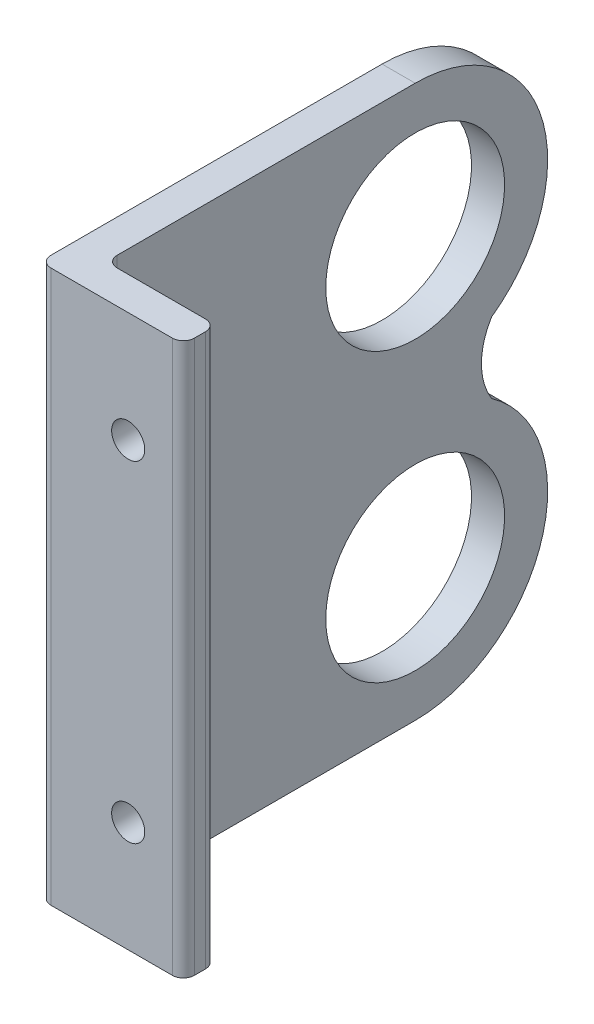
ISO-10303-21;
HEADER;
FILE_DESCRIPTION(('STEP AP214'),'2;1');
FILE_NAME('part.step','',(''),(''),'','','');
FILE_SCHEMA(('AUTOMOTIVE_DESIGN { 1 0 10303 214 1 1 1 1 }'));
ENDSEC;
DATA;
#1=APPLICATION_CONTEXT('core data for automotive mechanical design processes');
#2=APPLICATION_PROTOCOL_DEFINITION('international standard','automotive_design',2000,#1);
#3=PRODUCT_CONTEXT('',#1,'mechanical');
#4=PRODUCT('Part','Part','',(#3));
#5=PRODUCT_RELATED_PRODUCT_CATEGORY('part','',(#4));
#6=PRODUCT_DEFINITION_FORMATION('','',#4);
#7=PRODUCT_DEFINITION_CONTEXT('part definition',#1,'design');
#8=PRODUCT_DEFINITION('design','',#6,#7);
#9=PRODUCT_DEFINITION_SHAPE('','',#8);
#10=(LENGTH_UNIT() NAMED_UNIT(*) SI_UNIT(.MILLI.,.METRE.));
#11=(NAMED_UNIT(*) PLANE_ANGLE_UNIT() SI_UNIT($,.RADIAN.));
#12=(NAMED_UNIT(*) SI_UNIT($,.STERADIAN.) SOLID_ANGLE_UNIT());
#13=UNCERTAINTY_MEASURE_WITH_UNIT(LENGTH_MEASURE(1.E-05),#10,'distance_accuracy_value','');
#14=(GEOMETRIC_REPRESENTATION_CONTEXT(3) GLOBAL_UNCERTAINTY_ASSIGNED_CONTEXT((#13)) GLOBAL_UNIT_ASSIGNED_CONTEXT((#10,
#11,#12)) REPRESENTATION_CONTEXT('',''));
#15=CARTESIAN_POINT('',(0.,0.,0.));
#16=DIRECTION('',(0.,0.,1.));
#17=DIRECTION('',(1.,0.,0.));
#18=AXIS2_PLACEMENT_3D('',#15,#16,#17);
#19=CARTESIAN_POINT('',(3.75000000000001,50.,0.));
#20=DIRECTION('',(1.,0.,0.));
#21=DIRECTION('',(0.,0.,-1.));
#22=AXIS2_PLACEMENT_3D('',#19,#20,#21);
#23=PLANE('',#22);
#24=CARTESIAN_POINT('',(3.75,38.,-19.3125));
#25=DIRECTION('',(-1.,0.,0.));
#26=DIRECTION('',(0.,0.,1.));
#27=AXIS2_PLACEMENT_3D('',#24,#25,#26);
#28=CIRCLE('',#27,8.09999999999999);
#29=CARTESIAN_POINT('',(3.75000000000001,38.,-11.2125));
#30=VERTEX_POINT('',#29);
#31=EDGE_CURVE('E266',#30,#30,#28,.T.);
#32=ORIENTED_EDGE('',*,*,#31,.F.);
#33=EDGE_LOOP('',(#32));
#34=FACE_BOUND('',#33,.T.);
#35=CARTESIAN_POINT('',(3.75,12.,-19.3125));
#36=DIRECTION('',(-1.,0.,0.));
#37=DIRECTION('',(0.,0.,1.));
#38=AXIS2_PLACEMENT_3D('',#35,#36,#37);
#39=CIRCLE('',#38,8.1);
#40=CARTESIAN_POINT('',(3.75000000000001,12.,-11.2125));
#41=VERTEX_POINT('',#40);
#42=EDGE_CURVE('E253',#41,#41,#39,.T.);
#43=ORIENTED_EDGE('',*,*,#42,.F.);
#44=EDGE_LOOP('',(#43));
#45=FACE_BOUND('',#44,.T.);
#46=CARTESIAN_POINT('',(3.75,25.,-31.3125));
#47=DIRECTION('',(-1.,0.,0.));
#48=DIRECTION('',(0.,0.,1.));
#49=AXIS2_PLACEMENT_3D('',#46,#47,#48);
#50=CIRCLE('',#49,6.);
#51=CARTESIAN_POINT('',(3.75,21.8009515210218,-26.2364691855597));
#52=VERTEX_POINT('',#51);
#53=CARTESIAN_POINT('',(3.75,28.1990484789782,-26.2364691855597));
#54=VERTEX_POINT('',#53);
#55=EDGE_CURVE('E237',#52,#54,#50,.T.);
#56=ORIENTED_EDGE('',*,*,#55,.F.);
#57=CARTESIAN_POINT('',(3.75,12.,-19.3125));
#58=DIRECTION('',(-1.,0.,0.));
#59=DIRECTION('',(0.,0.,1.));
#60=AXIS2_PLACEMENT_3D('',#57,#58,#59);
#61=CIRCLE('',#60,12.);
#62=CARTESIAN_POINT('',(3.75,0.,-19.3125));
#63=VERTEX_POINT('',#62);
#64=EDGE_CURVE('E222',#52,#63,#61,.T.);
#65=ORIENTED_EDGE('',*,*,#64,.T.);
#66=DIRECTION('',(0.,0.,1.));
#67=VECTOR('',#66,1.);
#68=CARTESIAN_POINT('',(3.75000000000001,0.,0.));
#69=LINE('',#68,#67);
#70=CARTESIAN_POINT('',(3.75000000000001,0.,10.6875));
#71=VERTEX_POINT('',#70);
#72=EDGE_CURVE('E277',#63,#71,#69,.T.);
#73=ORIENTED_EDGE('',*,*,#72,.T.);
#74=DIRECTION('',(0.,-1.,0.));
#75=VECTOR('',#74,1.);
#76=CARTESIAN_POINT('',(3.75000000000001,50.,10.6875));
#77=LINE('',#76,#75);
#78=CARTESIAN_POINT('',(3.75000000000001,50.,10.6875));
#79=VERTEX_POINT('',#78);
#80=EDGE_CURVE('E12',#79,#71,#77,.T.);
#81=ORIENTED_EDGE('',*,*,#80,.F.);
#82=DIRECTION('',(0.,0.,1.));
#83=VECTOR('',#82,1.);
#84=CARTESIAN_POINT('',(3.75000000000001,50.,0.));
#85=LINE('',#84,#83);
#86=CARTESIAN_POINT('',(3.75,50.,-19.3125));
#87=VERTEX_POINT('',#86);
#88=EDGE_CURVE('E289',#87,#79,#85,.T.);
#89=ORIENTED_EDGE('',*,*,#88,.F.);
#90=CARTESIAN_POINT('',(3.75,38.,-19.3125));
#91=DIRECTION('',(-1.,0.,0.));
#92=DIRECTION('',(0.,0.,1.));
#93=AXIS2_PLACEMENT_3D('',#90,#91,#92);
#94=CIRCLE('',#93,12.);
#95=EDGE_CURVE('E140',#87,#54,#94,.T.);
#96=ORIENTED_EDGE('',*,*,#95,.T.);
#97=EDGE_LOOP('',(#56,#65,#73,#81,#89,#96));
#98=FACE_BOUND('',#97,.T.);
#99=ADVANCED_FACE('F125',(#34,#45,#98),#23,.F.);
#100=CARTESIAN_POINT('',(6.75000000000001,50.,0.));
#101=DIRECTION('',(1.,0.,0.));
#102=DIRECTION('',(0.,0.,-1.));
#103=AXIS2_PLACEMENT_3D('',#100,#101,#102);
#104=PLANE('',#103);
#105=CARTESIAN_POINT('',(6.75,38.,-19.3125));
#106=DIRECTION('',(-1.,0.,0.));
#107=DIRECTION('',(0.,0.,1.));
#108=AXIS2_PLACEMENT_3D('',#105,#106,#107);
#109=CIRCLE('',#108,8.09999999999999);
#110=CARTESIAN_POINT('',(6.75000000000001,38.,-11.2125));
#111=VERTEX_POINT('',#110);
#112=EDGE_CURVE('E257',#111,#111,#109,.T.);
#113=ORIENTED_EDGE('',*,*,#112,.T.);
#114=EDGE_LOOP('',(#113));
#115=FACE_BOUND('',#114,.T.);
#116=CARTESIAN_POINT('',(6.75,12.,-19.3125));
#117=DIRECTION('',(-1.,0.,0.));
#118=DIRECTION('',(0.,0.,1.));
#119=AXIS2_PLACEMENT_3D('',#116,#117,#118);
#120=CIRCLE('',#119,8.1);
#121=CARTESIAN_POINT('',(6.75000000000001,12.,-11.2125));
#122=VERTEX_POINT('',#121);
#123=EDGE_CURVE('E248',#122,#122,#120,.T.);
#124=ORIENTED_EDGE('',*,*,#123,.T.);
#125=EDGE_LOOP('',(#124));
#126=FACE_BOUND('',#125,.T.);
#127=CARTESIAN_POINT('',(6.75,12.,-19.3125));
#128=DIRECTION('',(-1.,0.,0.));
#129=DIRECTION('',(0.,0.,1.));
#130=AXIS2_PLACEMENT_3D('',#127,#128,#129);
#131=CIRCLE('',#130,12.);
#132=CARTESIAN_POINT('',(6.75,21.8009515210218,-26.2364691855597));
#133=VERTEX_POINT('',#132);
#134=CARTESIAN_POINT('',(6.75,0.,-19.3125));
#135=VERTEX_POINT('',#134);
#136=EDGE_CURVE('E148',#133,#135,#131,.T.);
#137=ORIENTED_EDGE('',*,*,#136,.F.);
#138=CARTESIAN_POINT('',(6.75,25.,-31.3125));
#139=DIRECTION('',(-1.,0.,0.));
#140=DIRECTION('',(0.,0.,1.));
#141=AXIS2_PLACEMENT_3D('',#138,#139,#140);
#142=CIRCLE('',#141,6.);
#143=CARTESIAN_POINT('',(6.75,28.1990484789782,-26.2364691855597));
#144=VERTEX_POINT('',#143);
#145=EDGE_CURVE('E217',#133,#144,#142,.T.);
#146=ORIENTED_EDGE('',*,*,#145,.T.);
#147=CARTESIAN_POINT('',(6.75,38.,-19.3125));
#148=DIRECTION('',(-1.,0.,0.));
#149=DIRECTION('',(0.,0.,1.));
#150=AXIS2_PLACEMENT_3D('',#147,#148,#149);
#151=CIRCLE('',#150,12.);
#152=CARTESIAN_POINT('',(6.75,50.,-19.3125));
#153=VERTEX_POINT('',#152);
#154=EDGE_CURVE('E258',#153,#144,#151,.T.);
#155=ORIENTED_EDGE('',*,*,#154,.F.);
#156=DIRECTION('',(0.,0.,1.));
#157=VECTOR('',#156,1.);
#158=CARTESIAN_POINT('',(6.75000000000001,50.,0.));
#159=LINE('',#158,#157);
#160=CARTESIAN_POINT('',(6.75000000000001,50.,7.6875));
#161=VERTEX_POINT('',#160);
#162=EDGE_CURVE('E318',#153,#161,#159,.T.);
#163=ORIENTED_EDGE('',*,*,#162,.T.);
#164=DIRECTION('',(0.,-1.,0.));
#165=VECTOR('',#164,1.);
#166=CARTESIAN_POINT('',(6.75000000000001,50.,7.6875));
#167=LINE('',#166,#165);
#168=CARTESIAN_POINT('',(6.75000000000001,0.,7.6875));
#169=VERTEX_POINT('',#168);
#170=EDGE_CURVE('E321',#161,#169,#167,.T.);
#171=ORIENTED_EDGE('',*,*,#170,.T.);
#172=DIRECTION('',(0.,0.,1.));
#173=VECTOR('',#172,1.);
#174=CARTESIAN_POINT('',(6.75000000000001,0.,0.));
#175=LINE('',#174,#173);
#176=EDGE_CURVE('E219',#135,#169,#175,.T.);
#177=ORIENTED_EDGE('',*,*,#176,.F.);
#178=EDGE_LOOP('',(#137,#146,#155,#163,#171,#177));
#179=FACE_BOUND('',#178,.T.);
#180=ADVANCED_FACE('F214',(#115,#126,#179),#104,.T.);
#181=CARTESIAN_POINT('',(0.,50.,0.));
#182=DIRECTION('',(0.,1.,0.));
#183=DIRECTION('',(0.,0.,1.));
#184=AXIS2_PLACEMENT_3D('',#181,#182,#183);
#185=PLANE('',#184);
#186=ORIENTED_EDGE('',*,*,#162,.F.);
#187=DIRECTION('',(-1.,0.,0.));
#188=VECTOR('',#187,1.);
#189=CARTESIAN_POINT('',(6.75,50.,-19.3125));
#190=LINE('',#189,#188);
#191=EDGE_CURVE('E261',#153,#87,#190,.T.);
#192=ORIENTED_EDGE('',*,*,#191,.T.);
#193=ORIENTED_EDGE('',*,*,#88,.T.);
#194=CARTESIAN_POINT('',(4.75000000000001,50.,10.6875));
#195=DIRECTION('',(0.,1.,0.));
#196=DIRECTION('',(0.,0.,1.));
#197=AXIS2_PLACEMENT_3D('',#194,#195,#196);
#198=CIRCLE('',#197,1.);
#199=CARTESIAN_POINT('',(4.75000000000002,50.,11.6875));
#200=VERTEX_POINT('',#199);
#201=EDGE_CURVE('E292',#79,#200,#198,.T.);
#202=ORIENTED_EDGE('',*,*,#201,.T.);
#203=DIRECTION('',(1.,0.,0.));
#204=VECTOR('',#203,1.);
#205=CARTESIAN_POINT('',(0.,50.,11.6875));
#206=LINE('',#205,#204);
#207=CARTESIAN_POINT('',(15.75,50.,11.6875));
#208=VERTEX_POINT('',#207);
#209=EDGE_CURVE('E295',#200,#208,#206,.T.);
#210=ORIENTED_EDGE('',*,*,#209,.T.);
#211=CARTESIAN_POINT('',(15.75,50.,10.6875));
#212=DIRECTION('',(0.,1.,0.));
#213=DIRECTION('',(0.,0.,1.));
#214=AXIS2_PLACEMENT_3D('',#211,#212,#213);
#215=CIRCLE('',#214,1.);
#216=CARTESIAN_POINT('',(16.75,50.,10.6875));
#217=VERTEX_POINT('',#216);
#218=EDGE_CURVE('E298',#217,#208,#215,.F.);
#219=ORIENTED_EDGE('',*,*,#218,.F.);
#220=DIRECTION('',(0.,0.,1.));
#221=VECTOR('',#220,1.);
#222=CARTESIAN_POINT('',(16.75,50.,0.));
#223=LINE('',#222,#221);
#224=CARTESIAN_POINT('',(16.75,50.,9.68750000000002));
#225=VERTEX_POINT('',#224);
#226=EDGE_CURVE('E302',#225,#217,#223,.T.);
#227=ORIENTED_EDGE('',*,*,#226,.F.);
#228=CARTESIAN_POINT('',(15.75,50.,9.68750000000001));
#229=DIRECTION('',(0.,1.,0.));
#230=DIRECTION('',(0.,0.,1.));
#231=AXIS2_PLACEMENT_3D('',#228,#229,#230);
#232=CIRCLE('',#231,1.);
#233=CARTESIAN_POINT('',(15.75,50.,8.68750000000001));
#234=VERTEX_POINT('',#233);
#235=EDGE_CURVE('E306',#234,#225,#232,.F.);
#236=ORIENTED_EDGE('',*,*,#235,.F.);
#237=DIRECTION('',(1.,0.,0.));
#238=VECTOR('',#237,1.);
#239=CARTESIAN_POINT('',(0.,50.,8.68750000000001));
#240=LINE('',#239,#238);
#241=CARTESIAN_POINT('',(7.75000000000002,50.,8.68750000000001));
#242=VERTEX_POINT('',#241);
#243=EDGE_CURVE('E310',#242,#234,#240,.T.);
#244=ORIENTED_EDGE('',*,*,#243,.F.);
#245=CARTESIAN_POINT('',(7.75000000000001,50.,7.68750000000001));
#246=DIRECTION('',(0.,1.,0.));
#247=DIRECTION('',(0.,0.,1.));
#248=AXIS2_PLACEMENT_3D('',#245,#246,#247);
#249=CIRCLE('',#248,1.);
#250=EDGE_CURVE('E314',#242,#161,#249,.F.);
#251=ORIENTED_EDGE('',*,*,#250,.T.);
#252=EDGE_LOOP('',(#186,#192,#193,#202,#210,#219,#227,#236,#244,#251));
#253=FACE_BOUND('',#252,.T.);
#254=ADVANCED_FACE('F391',(#253),#185,.T.);
#255=CARTESIAN_POINT('',(0.,0.,0.));
#256=DIRECTION('',(0.,1.,0.));
#257=DIRECTION('',(0.,0.,1.));
#258=AXIS2_PLACEMENT_3D('',#255,#256,#257);
#259=PLANE('',#258);
#260=DIRECTION('',(-1.,0.,0.));
#261=VECTOR('',#260,1.);
#262=CARTESIAN_POINT('',(6.75,0.,-19.3125));
#263=LINE('',#262,#261);
#264=EDGE_CURVE('E221',#135,#63,#263,.T.);
#265=ORIENTED_EDGE('',*,*,#264,.F.);
#266=ORIENTED_EDGE('',*,*,#176,.T.);
#267=CARTESIAN_POINT('',(7.75000000000001,0.,7.68750000000001));
#268=DIRECTION('',(0.,1.,0.));
#269=DIRECTION('',(0.,0.,1.));
#270=AXIS2_PLACEMENT_3D('',#267,#268,#269);
#271=CIRCLE('',#270,1.);
#272=CARTESIAN_POINT('',(7.75000000000002,0.,8.68750000000001));
#273=VERTEX_POINT('',#272);
#274=EDGE_CURVE('E347',#273,#169,#271,.F.);
#275=ORIENTED_EDGE('',*,*,#274,.F.);
#276=DIRECTION('',(1.,0.,0.));
#277=VECTOR('',#276,1.);
#278=CARTESIAN_POINT('',(0.,0.,8.68750000000001));
#279=LINE('',#278,#277);
#280=CARTESIAN_POINT('',(15.75,0.,8.68750000000001));
#281=VERTEX_POINT('',#280);
#282=EDGE_CURVE('E343',#273,#281,#279,.T.);
#283=ORIENTED_EDGE('',*,*,#282,.T.);
#284=CARTESIAN_POINT('',(15.75,0.,9.68750000000001));
#285=DIRECTION('',(0.,1.,0.));
#286=DIRECTION('',(0.,0.,1.));
#287=AXIS2_PLACEMENT_3D('',#284,#285,#286);
#288=CIRCLE('',#287,1.);
#289=CARTESIAN_POINT('',(16.75,0.,9.68750000000002));
#290=VERTEX_POINT('',#289);
#291=EDGE_CURVE('E339',#281,#290,#288,.F.);
#292=ORIENTED_EDGE('',*,*,#291,.T.);
#293=DIRECTION('',(0.,0.,1.));
#294=VECTOR('',#293,1.);
#295=CARTESIAN_POINT('',(16.75,0.,0.));
#296=LINE('',#295,#294);
#297=CARTESIAN_POINT('',(16.75,0.,10.6875));
#298=VERTEX_POINT('',#297);
#299=EDGE_CURVE('E335',#290,#298,#296,.T.);
#300=ORIENTED_EDGE('',*,*,#299,.T.);
#301=CARTESIAN_POINT('',(15.75,0.,10.6875));
#302=DIRECTION('',(0.,1.,0.));
#303=DIRECTION('',(0.,0.,1.));
#304=AXIS2_PLACEMENT_3D('',#301,#302,#303);
#305=CIRCLE('',#304,1.);
#306=CARTESIAN_POINT('',(15.75,0.,11.6875));
#307=VERTEX_POINT('',#306);
#308=EDGE_CURVE('E331',#298,#307,#305,.F.);
#309=ORIENTED_EDGE('',*,*,#308,.T.);
#310=DIRECTION('',(1.,0.,0.));
#311=VECTOR('',#310,1.);
#312=CARTESIAN_POINT('',(0.,0.,11.6875));
#313=LINE('',#312,#311);
#314=CARTESIAN_POINT('',(4.75000000000002,0.,11.6875));
#315=VERTEX_POINT('',#314);
#316=EDGE_CURVE('E327',#315,#307,#313,.T.);
#317=ORIENTED_EDGE('',*,*,#316,.F.);
#318=CARTESIAN_POINT('',(4.75000000000001,0.,10.6875));
#319=DIRECTION('',(0.,1.,0.));
#320=DIRECTION('',(0.,0.,1.));
#321=AXIS2_PLACEMENT_3D('',#318,#319,#320);
#322=CIRCLE('',#321,1.);
#323=EDGE_CURVE('E324',#71,#315,#322,.T.);
#324=ORIENTED_EDGE('',*,*,#323,.F.);
#325=ORIENTED_EDGE('',*,*,#72,.F.);
#326=EDGE_LOOP('',(#265,#266,#275,#283,#292,#300,#309,#317,#324,#325));
#327=FACE_BOUND('',#326,.T.);
#328=ADVANCED_FACE('F381',(#327),#259,.F.);
#329=CARTESIAN_POINT('',(4.75000000000001,50.,10.6875));
#330=DIRECTION('',(0.,-1.,0.));
#331=DIRECTION('',(0.,0.,-1.));
#332=AXIS2_PLACEMENT_3D('',#329,#330,#331);
#333=CYLINDRICAL_SURFACE('',#332,1.);
#334=ORIENTED_EDGE('',*,*,#323,.T.);
#335=DIRECTION('',(0.,-1.,0.));
#336=VECTOR('',#335,1.);
#337=CARTESIAN_POINT('',(4.75000000000002,50.,11.6875));
#338=LINE('',#337,#336);
#339=EDGE_CURVE('E133',#200,#315,#338,.T.);
#340=ORIENTED_EDGE('',*,*,#339,.F.);
#341=ORIENTED_EDGE('',*,*,#201,.F.);
#342=ORIENTED_EDGE('',*,*,#80,.T.);
#343=EDGE_LOOP('',(#334,#340,#341,#342));
#344=FACE_BOUND('',#343,.T.);
#345=ADVANCED_FACE('F411',(#344),#333,.T.);
#346=CARTESIAN_POINT('',(0.,50.,11.6875));
#347=DIRECTION('',(0.,0.,-1.));
#348=DIRECTION('',(-1.,0.,0.));
#349=AXIS2_PLACEMENT_3D('',#346,#347,#348);
#350=PLANE('',#349);
#351=CARTESIAN_POINT('',(11.75,40.,11.6875));
#352=DIRECTION('',(0.,0.,1.));
#353=DIRECTION('',(1.,0.,0.));
#354=AXIS2_PLACEMENT_3D('',#351,#352,#353);
#355=CIRCLE('',#354,1.5);
#356=CARTESIAN_POINT('',(13.25,40.,11.6875));
#357=VERTEX_POINT('',#356);
#358=EDGE_CURVE('E278',#357,#357,#355,.T.);
#359=ORIENTED_EDGE('',*,*,#358,.F.);
#360=EDGE_LOOP('',(#359));
#361=FACE_BOUND('',#360,.T.);
#362=CARTESIAN_POINT('',(11.75,10.,11.6875));
#363=DIRECTION('',(0.,0.,1.));
#364=DIRECTION('',(1.,0.,0.));
#365=AXIS2_PLACEMENT_3D('',#362,#363,#364);
#366=CIRCLE('',#365,1.5);
#367=CARTESIAN_POINT('',(13.25,10.,11.6875));
#368=VERTEX_POINT('',#367);
#369=EDGE_CURVE('E282',#368,#368,#366,.T.);
#370=ORIENTED_EDGE('',*,*,#369,.F.);
#371=EDGE_LOOP('',(#370));
#372=FACE_BOUND('',#371,.T.);
#373=ORIENTED_EDGE('',*,*,#316,.T.);
#374=DIRECTION('',(0.,-1.,0.));
#375=VECTOR('',#374,1.);
#376=CARTESIAN_POINT('',(15.75,50.,11.6875));
#377=LINE('',#376,#375);
#378=EDGE_CURVE('E367',#208,#307,#377,.T.);
#379=ORIENTED_EDGE('',*,*,#378,.F.);
#380=ORIENTED_EDGE('',*,*,#209,.F.);
#381=ORIENTED_EDGE('',*,*,#339,.T.);
#382=EDGE_LOOP('',(#373,#379,#380,#381));
#383=FACE_BOUND('',#382,.T.);
#384=ADVANCED_FACE('F375',(#361,#372,#383),#350,.F.);
#385=CARTESIAN_POINT('',(15.75,50.,10.6875));
#386=DIRECTION('',(0.,-1.,0.));
#387=DIRECTION('',(0.,0.,-1.));
#388=AXIS2_PLACEMENT_3D('',#385,#386,#387);
#389=CYLINDRICAL_SURFACE('',#388,1.);
#390=ORIENTED_EDGE('',*,*,#308,.F.);
#391=DIRECTION('',(0.,-1.,0.));
#392=VECTOR('',#391,1.);
#393=CARTESIAN_POINT('',(16.75,50.,10.6875));
#394=LINE('',#393,#392);
#395=EDGE_CURVE('E364',#217,#298,#394,.T.);
#396=ORIENTED_EDGE('',*,*,#395,.F.);
#397=ORIENTED_EDGE('',*,*,#218,.T.);
#398=ORIENTED_EDGE('',*,*,#378,.T.);
#399=EDGE_LOOP('',(#390,#396,#397,#398));
#400=FACE_BOUND('',#399,.T.);
#401=ADVANCED_FACE('F386',(#400),#389,.T.);
#402=CARTESIAN_POINT('',(16.75,50.,0.));
#403=DIRECTION('',(1.,0.,0.));
#404=DIRECTION('',(0.,0.,-1.));
#405=AXIS2_PLACEMENT_3D('',#402,#403,#404);
#406=PLANE('',#405);
#407=ORIENTED_EDGE('',*,*,#299,.F.);
#408=DIRECTION('',(0.,-1.,0.));
#409=VECTOR('',#408,1.);
#410=CARTESIAN_POINT('',(16.75,50.,9.68750000000002));
#411=LINE('',#410,#409);
#412=EDGE_CURVE('E361',#225,#290,#411,.T.);
#413=ORIENTED_EDGE('',*,*,#412,.F.);
#414=ORIENTED_EDGE('',*,*,#226,.T.);
#415=ORIENTED_EDGE('',*,*,#395,.T.);
#416=EDGE_LOOP('',(#407,#413,#414,#415));
#417=FACE_BOUND('',#416,.T.);
#418=ADVANCED_FACE('F394',(#417),#406,.T.);
#419=CARTESIAN_POINT('',(15.75,50.,9.68750000000001));
#420=DIRECTION('',(0.,-1.,0.));
#421=DIRECTION('',(0.,0.,-1.));
#422=AXIS2_PLACEMENT_3D('',#419,#420,#421);
#423=CYLINDRICAL_SURFACE('',#422,1.);
#424=ORIENTED_EDGE('',*,*,#291,.F.);
#425=DIRECTION('',(0.,-1.,0.));
#426=VECTOR('',#425,1.);
#427=CARTESIAN_POINT('',(15.75,50.,8.68750000000001));
#428=LINE('',#427,#426);
#429=EDGE_CURVE('E358',#234,#281,#428,.T.);
#430=ORIENTED_EDGE('',*,*,#429,.F.);
#431=ORIENTED_EDGE('',*,*,#235,.T.);
#432=ORIENTED_EDGE('',*,*,#412,.T.);
#433=EDGE_LOOP('',(#424,#430,#431,#432));
#434=FACE_BOUND('',#433,.T.);
#435=ADVANCED_FACE('F397',(#434),#423,.T.);
#436=CARTESIAN_POINT('',(0.,50.,8.68750000000001));
#437=DIRECTION('',(0.,0.,-1.));
#438=DIRECTION('',(-1.,0.,0.));
#439=AXIS2_PLACEMENT_3D('',#436,#437,#438);
#440=PLANE('',#439);
#441=CARTESIAN_POINT('',(11.75,40.,8.68750000000001));
#442=DIRECTION('',(0.,0.,1.));
#443=DIRECTION('',(1.,0.,0.));
#444=AXIS2_PLACEMENT_3D('',#441,#442,#443);
#445=CIRCLE('',#444,1.5);
#446=CARTESIAN_POINT('',(13.25,40.,8.68750000000001));
#447=VERTEX_POINT('',#446);
#448=EDGE_CURVE('E273',#447,#447,#445,.T.);
#449=ORIENTED_EDGE('',*,*,#448,.T.);
#450=EDGE_LOOP('',(#449));
#451=FACE_BOUND('',#450,.T.);
#452=CARTESIAN_POINT('',(11.75,10.,8.68750000000001));
#453=DIRECTION('',(0.,0.,1.));
#454=DIRECTION('',(1.,0.,0.));
#455=AXIS2_PLACEMENT_3D('',#452,#453,#454);
#456=CIRCLE('',#455,1.5);
#457=CARTESIAN_POINT('',(13.25,10.,8.68750000000001));
#458=VERTEX_POINT('',#457);
#459=EDGE_CURVE('E252',#458,#458,#456,.T.);
#460=ORIENTED_EDGE('',*,*,#459,.T.);
#461=EDGE_LOOP('',(#460));
#462=FACE_BOUND('',#461,.T.);
#463=ORIENTED_EDGE('',*,*,#282,.F.);
#464=DIRECTION('',(0.,-1.,0.));
#465=VECTOR('',#464,1.);
#466=CARTESIAN_POINT('',(7.75000000000002,50.,8.68750000000001));
#467=LINE('',#466,#465);
#468=EDGE_CURVE('E355',#242,#273,#467,.T.);
#469=ORIENTED_EDGE('',*,*,#468,.F.);
#470=ORIENTED_EDGE('',*,*,#243,.T.);
#471=ORIENTED_EDGE('',*,*,#429,.T.);
#472=EDGE_LOOP('',(#463,#469,#470,#471));
#473=FACE_BOUND('',#472,.T.);
#474=ADVANCED_FACE('F401',(#451,#462,#473),#440,.T.);
#475=CARTESIAN_POINT('',(7.75000000000001,50.,7.68750000000001));
#476=DIRECTION('',(0.,-1.,0.));
#477=DIRECTION('',(0.,0.,-1.));
#478=AXIS2_PLACEMENT_3D('',#475,#476,#477);
#479=CYLINDRICAL_SURFACE('',#478,1.);
#480=ORIENTED_EDGE('',*,*,#274,.T.);
#481=ORIENTED_EDGE('',*,*,#170,.F.);
#482=ORIENTED_EDGE('',*,*,#250,.F.);
#483=ORIENTED_EDGE('',*,*,#468,.T.);
#484=EDGE_LOOP('',(#480,#481,#482,#483));
#485=FACE_BOUND('',#484,.T.);
#486=ADVANCED_FACE('F406',(#485),#479,.F.);
#487=CARTESIAN_POINT('',(11.75,10.,8.68750000000001));
#488=DIRECTION('',(0.,0.,1.));
#489=DIRECTION('',(1.,0.,0.));
#490=AXIS2_PLACEMENT_3D('',#487,#488,#489);
#491=CYLINDRICAL_SURFACE('',#490,1.5);
#492=ORIENTED_EDGE('',*,*,#459,.F.);
#493=EDGE_LOOP('',(#492));
#494=FACE_BOUND('',#493,.T.);
#495=ORIENTED_EDGE('',*,*,#369,.T.);
#496=EDGE_LOOP('',(#495));
#497=FACE_BOUND('',#496,.T.);
#498=ADVANCED_FACE('F450',(#494,#497),#491,.F.);
#499=CARTESIAN_POINT('',(11.75,40.,8.68750000000001));
#500=DIRECTION('',(0.,0.,1.));
#501=DIRECTION('',(1.,0.,0.));
#502=AXIS2_PLACEMENT_3D('',#499,#500,#501);
#503=CYLINDRICAL_SURFACE('',#502,1.5);
#504=ORIENTED_EDGE('',*,*,#448,.F.);
#505=EDGE_LOOP('',(#504));
#506=FACE_BOUND('',#505,.T.);
#507=ORIENTED_EDGE('',*,*,#358,.T.);
#508=EDGE_LOOP('',(#507));
#509=FACE_BOUND('',#508,.T.);
#510=ADVANCED_FACE('F447',(#506,#509),#503,.F.);
#511=CARTESIAN_POINT('',(6.75,12.,-19.3125));
#512=DIRECTION('',(-1.,0.,0.));
#513=DIRECTION('',(0.,0.,1.));
#514=AXIS2_PLACEMENT_3D('',#511,#512,#513);
#515=CYLINDRICAL_SURFACE('',#514,12.);
#516=ORIENTED_EDGE('',*,*,#64,.F.);
#517=DIRECTION('',(-1.,0.,0.));
#518=VECTOR('',#517,1.);
#519=CARTESIAN_POINT('',(6.75,21.8009515210218,-26.2364691855597));
#520=LINE('',#519,#518);
#521=EDGE_CURVE('E225',#133,#52,#520,.T.);
#522=ORIENTED_EDGE('',*,*,#521,.F.);
#523=ORIENTED_EDGE('',*,*,#136,.T.);
#524=ORIENTED_EDGE('',*,*,#264,.T.);
#525=EDGE_LOOP('',(#516,#522,#523,#524));
#526=FACE_BOUND('',#525,.T.);
#527=ADVANCED_FACE('F226',(#526),#515,.T.);
#528=CARTESIAN_POINT('',(6.75,38.,-19.3125));
#529=DIRECTION('',(-1.,0.,0.));
#530=DIRECTION('',(0.,0.,1.));
#531=AXIS2_PLACEMENT_3D('',#528,#529,#530);
#532=CYLINDRICAL_SURFACE('',#531,12.);
#533=ORIENTED_EDGE('',*,*,#95,.F.);
#534=ORIENTED_EDGE('',*,*,#191,.F.);
#535=ORIENTED_EDGE('',*,*,#154,.T.);
#536=DIRECTION('',(-1.,0.,0.));
#537=VECTOR('',#536,1.);
#538=CARTESIAN_POINT('',(6.75,28.1990484789782,-26.2364691855597));
#539=LINE('',#538,#537);
#540=EDGE_CURVE('E232',#144,#54,#539,.T.);
#541=ORIENTED_EDGE('',*,*,#540,.T.);
#542=EDGE_LOOP('',(#533,#534,#535,#541));
#543=FACE_BOUND('',#542,.T.);
#544=ADVANCED_FACE('F408',(#543),#532,.T.);
#545=CARTESIAN_POINT('',(6.75,12.,-19.3125));
#546=DIRECTION('',(-1.,0.,0.));
#547=DIRECTION('',(0.,0.,1.));
#548=AXIS2_PLACEMENT_3D('',#545,#546,#547);
#549=CYLINDRICAL_SURFACE('',#548,8.1);
#550=ORIENTED_EDGE('',*,*,#123,.F.);
#551=EDGE_LOOP('',(#550));
#552=FACE_BOUND('',#551,.T.);
#553=ORIENTED_EDGE('',*,*,#42,.T.);
#554=EDGE_LOOP('',(#553));
#555=FACE_BOUND('',#554,.T.);
#556=ADVANCED_FACE('F431',(#552,#555),#549,.F.);
#557=CARTESIAN_POINT('',(6.75,38.,-19.3125));
#558=DIRECTION('',(-1.,0.,0.));
#559=DIRECTION('',(0.,0.,1.));
#560=AXIS2_PLACEMENT_3D('',#557,#558,#559);
#561=CYLINDRICAL_SURFACE('',#560,8.09999999999999);
#562=ORIENTED_EDGE('',*,*,#112,.F.);
#563=EDGE_LOOP('',(#562));
#564=FACE_BOUND('',#563,.T.);
#565=ORIENTED_EDGE('',*,*,#31,.T.);
#566=EDGE_LOOP('',(#565));
#567=FACE_BOUND('',#566,.T.);
#568=ADVANCED_FACE('F433',(#564,#567),#561,.F.);
#569=CARTESIAN_POINT('',(6.75,25.,-31.3125));
#570=DIRECTION('',(-1.,0.,0.));
#571=DIRECTION('',(0.,0.,1.));
#572=AXIS2_PLACEMENT_3D('',#569,#570,#571);
#573=CYLINDRICAL_SURFACE('',#572,6.);
#574=ORIENTED_EDGE('',*,*,#55,.T.);
#575=ORIENTED_EDGE('',*,*,#540,.F.);
#576=ORIENTED_EDGE('',*,*,#145,.F.);
#577=ORIENTED_EDGE('',*,*,#521,.T.);
#578=EDGE_LOOP('',(#574,#575,#576,#577));
#579=FACE_BOUND('',#578,.T.);
#580=ADVANCED_FACE('F235',(#579),#573,.F.);
#581=CLOSED_SHELL('',(#99,#180,#254,#328,#345,#384,#401,#418,#435,#474,#486,#498,#510,#527,#544,
#556,#568,#580));
#582=MANIFOLD_SOLID_BREP('B2',#581);
#583=ADVANCED_BREP_SHAPE_REPRESENTATION('',(#18,#582),#14);
#584=SHAPE_DEFINITION_REPRESENTATION(#9,#583);
ENDSEC;
END-ISO-10303-21;
